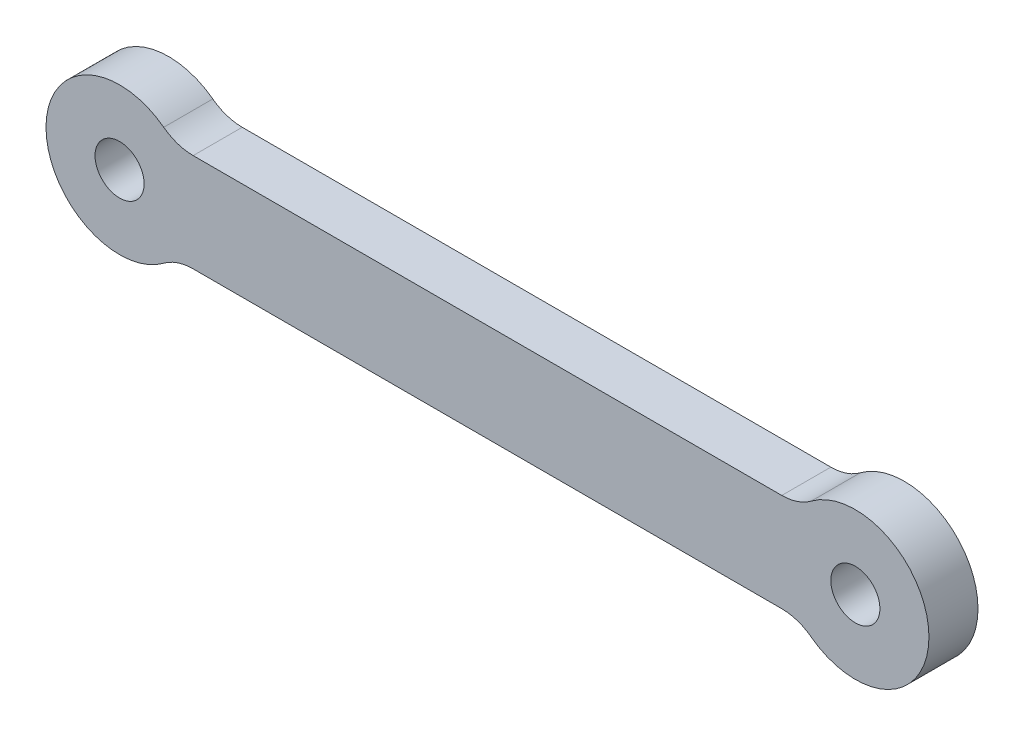
ISO-10303-21;
HEADER;
FILE_DESCRIPTION(('STEP AP214'),'2;1');
FILE_NAME('part.step','',(''),(''),'','','');
FILE_SCHEMA(('AUTOMOTIVE_DESIGN { 1 0 10303 214 1 1 1 1 }'));
ENDSEC;
DATA;
#1=APPLICATION_CONTEXT('core data for automotive mechanical design processes');
#2=APPLICATION_PROTOCOL_DEFINITION('international standard','automotive_design',2000,#1);
#3=PRODUCT_CONTEXT('',#1,'mechanical');
#4=PRODUCT('Part','Part','',(#3));
#5=PRODUCT_RELATED_PRODUCT_CATEGORY('part','',(#4));
#6=PRODUCT_DEFINITION_FORMATION('','',#4);
#7=PRODUCT_DEFINITION_CONTEXT('part definition',#1,'design');
#8=PRODUCT_DEFINITION('design','',#6,#7);
#9=PRODUCT_DEFINITION_SHAPE('','',#8);
#10=(LENGTH_UNIT() NAMED_UNIT(*) SI_UNIT(.MILLI.,.METRE.));
#11=(NAMED_UNIT(*) PLANE_ANGLE_UNIT() SI_UNIT($,.RADIAN.));
#12=(NAMED_UNIT(*) SI_UNIT($,.STERADIAN.) SOLID_ANGLE_UNIT());
#13=UNCERTAINTY_MEASURE_WITH_UNIT(LENGTH_MEASURE(1.E-05),#10,'distance_accuracy_value','');
#14=(GEOMETRIC_REPRESENTATION_CONTEXT(3) GLOBAL_UNCERTAINTY_ASSIGNED_CONTEXT((#13)) GLOBAL_UNIT_ASSIGNED_CONTEXT((#10,
#11,#12)) REPRESENTATION_CONTEXT('',''));
#15=CARTESIAN_POINT('',(0.,0.,0.));
#16=DIRECTION('',(0.,0.,1.));
#17=DIRECTION('',(1.,0.,0.));
#18=AXIS2_PLACEMENT_3D('',#15,#16,#17);
#19=CARTESIAN_POINT('',(12.,4.,2.));
#20=DIRECTION('',(0.,0.,1.));
#21=DIRECTION('',(1.,0.,0.));
#22=AXIS2_PLACEMENT_3D('',#19,#20,#21);
#23=PLANE('',#22);
#24=DIRECTION('',(1.,0.,0.));
#25=VECTOR('',#24,1.);
#26=CARTESIAN_POINT('',(0.,2.,2.));
#27=LINE('',#26,#25);
#28=CARTESIAN_POINT('',(-12.,2.,2.));
#29=VERTEX_POINT('',#28);
#30=CARTESIAN_POINT('',(12.,2.,2.));
#31=VERTEX_POINT('',#30);
#32=EDGE_CURVE('E198',#29,#31,#27,.T.);
#33=ORIENTED_EDGE('',*,*,#32,.F.);
#34=CARTESIAN_POINT('',(-12.,4.,2.));
#35=DIRECTION('',(0.,0.,-1.));
#36=DIRECTION('',(-1.,0.,0.));
#37=AXIS2_PLACEMENT_3D('',#34,#35,#36);
#38=CIRCLE('',#37,2.);
#39=CARTESIAN_POINT('',(-13.2,2.4,2.));
#40=VERTEX_POINT('',#39);
#41=EDGE_CURVE('E179',#29,#40,#38,.T.);
#42=ORIENTED_EDGE('',*,*,#41,.T.);
#43=CARTESIAN_POINT('',(-15.,0.,2.));
#44=DIRECTION('',(0.,0.,1.));
#45=DIRECTION('',(1.,0.,0.));
#46=AXIS2_PLACEMENT_3D('',#43,#44,#45);
#47=CIRCLE('',#46,3.);
#48=CARTESIAN_POINT('',(-13.2,-2.4,2.));
#49=VERTEX_POINT('',#48);
#50=EDGE_CURVE('E166',#40,#49,#47,.T.);
#51=ORIENTED_EDGE('',*,*,#50,.T.);
#52=CARTESIAN_POINT('',(-12.,-4.,2.));
#53=DIRECTION('',(0.,0.,-1.));
#54=DIRECTION('',(-1.,0.,0.));
#55=AXIS2_PLACEMENT_3D('',#52,#53,#54);
#56=CIRCLE('',#55,2.);
#57=CARTESIAN_POINT('',(-12.,-2.,2.));
#58=VERTEX_POINT('',#57);
#59=EDGE_CURVE('E163',#49,#58,#56,.T.);
#60=ORIENTED_EDGE('',*,*,#59,.T.);
#61=DIRECTION('',(-1.,0.,0.));
#62=VECTOR('',#61,1.);
#63=CARTESIAN_POINT('',(12.,-2.,2.));
#64=LINE('',#63,#62);
#65=CARTESIAN_POINT('',(12.,-2.,2.));
#66=VERTEX_POINT('',#65);
#67=EDGE_CURVE('E152',#66,#58,#64,.T.);
#68=ORIENTED_EDGE('',*,*,#67,.F.);
#69=CARTESIAN_POINT('',(12.,-4.,2.));
#70=DIRECTION('',(0.,0.,1.));
#71=DIRECTION('',(1.,0.,0.));
#72=AXIS2_PLACEMENT_3D('',#69,#70,#71);
#73=CIRCLE('',#72,2.);
#74=CARTESIAN_POINT('',(13.2,-2.4,2.));
#75=VERTEX_POINT('',#74);
#76=EDGE_CURVE('E160',#75,#66,#73,.T.);
#77=ORIENTED_EDGE('',*,*,#76,.F.);
#78=CARTESIAN_POINT('',(15.,0.,2.));
#79=DIRECTION('',(0.,0.,-1.));
#80=DIRECTION('',(-1.,0.,0.));
#81=AXIS2_PLACEMENT_3D('',#78,#79,#80);
#82=CIRCLE('',#81,3.);
#83=CARTESIAN_POINT('',(13.2,2.4,2.));
#84=VERTEX_POINT('',#83);
#85=EDGE_CURVE('E206',#84,#75,#82,.T.);
#86=ORIENTED_EDGE('',*,*,#85,.F.);
#87=CARTESIAN_POINT('',(12.,4.,2.));
#88=DIRECTION('',(0.,0.,1.));
#89=DIRECTION('',(1.,0.,0.));
#90=AXIS2_PLACEMENT_3D('',#87,#88,#89);
#91=CIRCLE('',#90,2.);
#92=EDGE_CURVE('E202',#31,#84,#91,.T.);
#93=ORIENTED_EDGE('',*,*,#92,.F.);
#94=EDGE_LOOP('',(#33,#42,#51,#60,#68,#77,#86,#93));
#95=FACE_BOUND('',#94,.T.);
#96=CARTESIAN_POINT('',(15.,0.,2.));
#97=DIRECTION('',(0.,0.,1.));
#98=DIRECTION('',(1.,0.,0.));
#99=AXIS2_PLACEMENT_3D('',#96,#97,#98);
#100=CIRCLE('',#99,1.);
#101=CARTESIAN_POINT('',(16.,0.,2.));
#102=VERTEX_POINT('',#101);
#103=EDGE_CURVE('E188',#102,#102,#100,.T.);
#104=ORIENTED_EDGE('',*,*,#103,.F.);
#105=EDGE_LOOP('',(#104));
#106=FACE_BOUND('',#105,.T.);
#107=CARTESIAN_POINT('',(-15.,0.,2.));
#108=DIRECTION('',(0.,0.,-1.));
#109=DIRECTION('',(-1.,0.,0.));
#110=AXIS2_PLACEMENT_3D('',#107,#108,#109);
#111=CIRCLE('',#110,1.);
#112=CARTESIAN_POINT('',(-16.,0.,2.));
#113=VERTEX_POINT('',#112);
#114=EDGE_CURVE('E292',#113,#113,#111,.T.);
#115=ORIENTED_EDGE('',*,*,#114,.T.);
#116=EDGE_LOOP('',(#115));
#117=FACE_BOUND('',#116,.T.);
#118=ADVANCED_FACE('F81',(#95,#106,#117),#23,.T.);
#119=CARTESIAN_POINT('',(12.,4.,0.));
#120=DIRECTION('',(0.,0.,1.));
#121=DIRECTION('',(1.,0.,0.));
#122=AXIS2_PLACEMENT_3D('',#119,#120,#121);
#123=PLANE('',#122);
#124=DIRECTION('',(-1.,0.,0.));
#125=VECTOR('',#124,1.);
#126=CARTESIAN_POINT('',(12.,-2.,0.));
#127=LINE('',#126,#125);
#128=CARTESIAN_POINT('',(12.,-2.,0.));
#129=VERTEX_POINT('',#128);
#130=CARTESIAN_POINT('',(-12.,-2.,0.));
#131=VERTEX_POINT('',#130);
#132=EDGE_CURVE('E203',#129,#131,#127,.T.);
#133=ORIENTED_EDGE('',*,*,#132,.T.);
#134=CARTESIAN_POINT('',(-12.,-4.,0.));
#135=DIRECTION('',(0.,0.,-1.));
#136=DIRECTION('',(-1.,0.,0.));
#137=AXIS2_PLACEMENT_3D('',#134,#135,#136);
#138=CIRCLE('',#137,2.);
#139=CARTESIAN_POINT('',(-13.2,-2.4,0.));
#140=VERTEX_POINT('',#139);
#141=EDGE_CURVE('E176',#140,#131,#138,.T.);
#142=ORIENTED_EDGE('',*,*,#141,.F.);
#143=CARTESIAN_POINT('',(-15.,0.,0.));
#144=DIRECTION('',(0.,0.,1.));
#145=DIRECTION('',(1.,0.,0.));
#146=AXIS2_PLACEMENT_3D('',#143,#144,#145);
#147=CIRCLE('',#146,3.);
#148=CARTESIAN_POINT('',(-13.2,2.4,0.));
#149=VERTEX_POINT('',#148);
#150=EDGE_CURVE('E240',#149,#140,#147,.T.);
#151=ORIENTED_EDGE('',*,*,#150,.F.);
#152=CARTESIAN_POINT('',(-12.,4.,0.));
#153=DIRECTION('',(0.,0.,-1.));
#154=DIRECTION('',(-1.,0.,0.));
#155=AXIS2_PLACEMENT_3D('',#152,#153,#154);
#156=CIRCLE('',#155,2.);
#157=CARTESIAN_POINT('',(-12.,2.,0.));
#158=VERTEX_POINT('',#157);
#159=EDGE_CURVE('E171',#158,#149,#156,.T.);
#160=ORIENTED_EDGE('',*,*,#159,.F.);
#161=DIRECTION('',(1.,0.,0.));
#162=VECTOR('',#161,1.);
#163=CARTESIAN_POINT('',(0.,2.,0.));
#164=LINE('',#163,#162);
#165=CARTESIAN_POINT('',(12.,2.,0.));
#166=VERTEX_POINT('',#165);
#167=EDGE_CURVE('E192',#158,#166,#164,.T.);
#168=ORIENTED_EDGE('',*,*,#167,.T.);
#169=CARTESIAN_POINT('',(12.,4.,0.));
#170=DIRECTION('',(0.,0.,1.));
#171=DIRECTION('',(1.,0.,0.));
#172=AXIS2_PLACEMENT_3D('',#169,#170,#171);
#173=CIRCLE('',#172,2.);
#174=CARTESIAN_POINT('',(13.2,2.4,0.));
#175=VERTEX_POINT('',#174);
#176=EDGE_CURVE('E214',#166,#175,#173,.T.);
#177=ORIENTED_EDGE('',*,*,#176,.T.);
#178=CARTESIAN_POINT('',(15.,0.,0.));
#179=DIRECTION('',(0.,0.,-1.));
#180=DIRECTION('',(-1.,0.,0.));
#181=AXIS2_PLACEMENT_3D('',#178,#179,#180);
#182=CIRCLE('',#181,3.);
#183=CARTESIAN_POINT('',(13.2,-2.4,0.));
#184=VERTEX_POINT('',#183);
#185=EDGE_CURVE('E218',#175,#184,#182,.T.);
#186=ORIENTED_EDGE('',*,*,#185,.T.);
#187=CARTESIAN_POINT('',(12.,-4.,0.));
#188=DIRECTION('',(0.,0.,1.));
#189=DIRECTION('',(1.,0.,0.));
#190=AXIS2_PLACEMENT_3D('',#187,#188,#189);
#191=CIRCLE('',#190,2.);
#192=EDGE_CURVE('E222',#184,#129,#191,.T.);
#193=ORIENTED_EDGE('',*,*,#192,.T.);
#194=EDGE_LOOP('',(#133,#142,#151,#160,#168,#177,#186,#193));
#195=FACE_BOUND('',#194,.T.);
#196=CARTESIAN_POINT('',(15.,0.,0.));
#197=DIRECTION('',(0.,0.,1.));
#198=DIRECTION('',(1.,0.,0.));
#199=AXIS2_PLACEMENT_3D('',#196,#197,#198);
#200=CIRCLE('',#199,1.);
#201=CARTESIAN_POINT('',(16.,0.,0.));
#202=VERTEX_POINT('',#201);
#203=EDGE_CURVE('E193',#202,#202,#200,.T.);
#204=ORIENTED_EDGE('',*,*,#203,.T.);
#205=EDGE_LOOP('',(#204));
#206=FACE_BOUND('',#205,.T.);
#207=CARTESIAN_POINT('',(-15.,0.,0.));
#208=DIRECTION('',(0.,0.,-1.));
#209=DIRECTION('',(-1.,0.,0.));
#210=AXIS2_PLACEMENT_3D('',#207,#208,#209);
#211=CIRCLE('',#210,1.);
#212=CARTESIAN_POINT('',(-16.,0.,0.));
#213=VERTEX_POINT('',#212);
#214=EDGE_CURVE('E295',#213,#213,#211,.T.);
#215=ORIENTED_EDGE('',*,*,#214,.F.);
#216=EDGE_LOOP('',(#215));
#217=FACE_BOUND('',#216,.T.);
#218=ADVANCED_FACE('F237',(#195,#206,#217),#123,.F.);
#219=CARTESIAN_POINT('',(12.,-2.,2.));
#220=DIRECTION('',(0.,-1.,0.));
#221=DIRECTION('',(0.,0.,-1.));
#222=AXIS2_PLACEMENT_3D('',#219,#220,#221);
#223=PLANE('',#222);
#224=ORIENTED_EDGE('',*,*,#132,.F.);
#225=DIRECTION('',(0.,0.,-1.));
#226=VECTOR('',#225,1.);
#227=CARTESIAN_POINT('',(12.,-2.,2.));
#228=LINE('',#227,#226);
#229=EDGE_CURVE('E12',#66,#129,#228,.T.);
#230=ORIENTED_EDGE('',*,*,#229,.F.);
#231=ORIENTED_EDGE('',*,*,#67,.T.);
#232=DIRECTION('',(0.,0.,-1.));
#233=VECTOR('',#232,1.);
#234=CARTESIAN_POINT('',(-12.,-2.,2.));
#235=LINE('',#234,#233);
#236=EDGE_CURVE('E156',#58,#131,#235,.T.);
#237=ORIENTED_EDGE('',*,*,#236,.T.);
#238=EDGE_LOOP('',(#224,#230,#231,#237));
#239=FACE_BOUND('',#238,.T.);
#240=ADVANCED_FACE('F154',(#239),#223,.T.);
#241=CARTESIAN_POINT('',(12.,-4.,2.));
#242=DIRECTION('',(0.,0.,-1.));
#243=DIRECTION('',(-1.,0.,0.));
#244=AXIS2_PLACEMENT_3D('',#241,#242,#243);
#245=CYLINDRICAL_SURFACE('',#244,2.);
#246=ORIENTED_EDGE('',*,*,#192,.F.);
#247=DIRECTION('',(0.,0.,-1.));
#248=VECTOR('',#247,1.);
#249=CARTESIAN_POINT('',(13.2,-2.4,2.));
#250=LINE('',#249,#248);
#251=EDGE_CURVE('E92',#75,#184,#250,.T.);
#252=ORIENTED_EDGE('',*,*,#251,.F.);
#253=ORIENTED_EDGE('',*,*,#76,.T.);
#254=ORIENTED_EDGE('',*,*,#229,.T.);
#255=EDGE_LOOP('',(#246,#252,#253,#254));
#256=FACE_BOUND('',#255,.T.);
#257=ADVANCED_FACE('F258',(#256),#245,.F.);
#258=CARTESIAN_POINT('',(15.,0.,2.));
#259=DIRECTION('',(0.,0.,-1.));
#260=DIRECTION('',(-1.,0.,0.));
#261=AXIS2_PLACEMENT_3D('',#258,#259,#260);
#262=CYLINDRICAL_SURFACE('',#261,3.);
#263=ORIENTED_EDGE('',*,*,#185,.F.);
#264=DIRECTION('',(0.,0.,-1.));
#265=VECTOR('',#264,1.);
#266=CARTESIAN_POINT('',(13.2,2.4,2.));
#267=LINE('',#266,#265);
#268=EDGE_CURVE('E228',#84,#175,#267,.T.);
#269=ORIENTED_EDGE('',*,*,#268,.F.);
#270=ORIENTED_EDGE('',*,*,#85,.T.);
#271=ORIENTED_EDGE('',*,*,#251,.T.);
#272=EDGE_LOOP('',(#263,#269,#270,#271));
#273=FACE_BOUND('',#272,.T.);
#274=ADVANCED_FACE('F257',(#273),#262,.T.);
#275=CARTESIAN_POINT('',(12.,4.,2.));
#276=DIRECTION('',(0.,0.,-1.));
#277=DIRECTION('',(-1.,0.,0.));
#278=AXIS2_PLACEMENT_3D('',#275,#276,#277);
#279=CYLINDRICAL_SURFACE('',#278,2.);
#280=ORIENTED_EDGE('',*,*,#176,.F.);
#281=DIRECTION('',(0.,0.,-1.));
#282=VECTOR('',#281,1.);
#283=CARTESIAN_POINT('',(12.,2.,2.));
#284=LINE('',#283,#282);
#285=EDGE_CURVE('E85',#31,#166,#284,.T.);
#286=ORIENTED_EDGE('',*,*,#285,.F.);
#287=ORIENTED_EDGE('',*,*,#92,.T.);
#288=ORIENTED_EDGE('',*,*,#268,.T.);
#289=EDGE_LOOP('',(#280,#286,#287,#288));
#290=FACE_BOUND('',#289,.T.);
#291=ADVANCED_FACE('F234',(#290),#279,.F.);
#292=CARTESIAN_POINT('',(0.,2.,2.));
#293=DIRECTION('',(0.,1.,0.));
#294=DIRECTION('',(0.,0.,1.));
#295=AXIS2_PLACEMENT_3D('',#292,#293,#294);
#296=PLANE('',#295);
#297=ORIENTED_EDGE('',*,*,#167,.F.);
#298=DIRECTION('',(0.,0.,-1.));
#299=VECTOR('',#298,1.);
#300=CARTESIAN_POINT('',(-12.,2.,2.));
#301=LINE('',#300,#299);
#302=EDGE_CURVE('E197',#29,#158,#301,.T.);
#303=ORIENTED_EDGE('',*,*,#302,.F.);
#304=ORIENTED_EDGE('',*,*,#32,.T.);
#305=ORIENTED_EDGE('',*,*,#285,.T.);
#306=EDGE_LOOP('',(#297,#303,#304,#305));
#307=FACE_BOUND('',#306,.T.);
#308=ADVANCED_FACE('F83',(#307),#296,.T.);
#309=CARTESIAN_POINT('',(15.,0.,2.));
#310=DIRECTION('',(0.,0.,-1.));
#311=DIRECTION('',(-1.,0.,0.));
#312=AXIS2_PLACEMENT_3D('',#309,#310,#311);
#313=CYLINDRICAL_SURFACE('',#312,1.);
#314=ORIENTED_EDGE('',*,*,#103,.T.);
#315=EDGE_LOOP('',(#314));
#316=FACE_BOUND('',#315,.T.);
#317=ORIENTED_EDGE('',*,*,#203,.F.);
#318=EDGE_LOOP('',(#317));
#319=FACE_BOUND('',#318,.T.);
#320=ADVANCED_FACE('F274',(#316,#319),#313,.F.);
#321=CARTESIAN_POINT('',(-12.,4.,2.));
#322=DIRECTION('',(0.,0.,-1.));
#323=DIRECTION('',(-1.,0.,0.));
#324=AXIS2_PLACEMENT_3D('',#321,#322,#323);
#325=CYLINDRICAL_SURFACE('',#324,2.);
#326=ORIENTED_EDGE('',*,*,#159,.T.);
#327=DIRECTION('',(0.,0.,-1.));
#328=VECTOR('',#327,1.);
#329=CARTESIAN_POINT('',(-13.2,2.4,2.));
#330=LINE('',#329,#328);
#331=EDGE_CURVE('E183',#40,#149,#330,.T.);
#332=ORIENTED_EDGE('',*,*,#331,.F.);
#333=ORIENTED_EDGE('',*,*,#41,.F.);
#334=ORIENTED_EDGE('',*,*,#302,.T.);
#335=EDGE_LOOP('',(#326,#332,#333,#334));
#336=FACE_BOUND('',#335,.T.);
#337=ADVANCED_FACE('F255',(#336),#325,.F.);
#338=CARTESIAN_POINT('',(-15.,0.,2.));
#339=DIRECTION('',(0.,0.,-1.));
#340=DIRECTION('',(-1.,0.,0.));
#341=AXIS2_PLACEMENT_3D('',#338,#339,#340);
#342=CYLINDRICAL_SURFACE('',#341,3.);
#343=ORIENTED_EDGE('',*,*,#150,.T.);
#344=DIRECTION('',(0.,0.,-1.));
#345=VECTOR('',#344,1.);
#346=CARTESIAN_POINT('',(-13.2,-2.4,2.));
#347=LINE('',#346,#345);
#348=EDGE_CURVE('E178',#49,#140,#347,.T.);
#349=ORIENTED_EDGE('',*,*,#348,.F.);
#350=ORIENTED_EDGE('',*,*,#50,.F.);
#351=ORIENTED_EDGE('',*,*,#331,.T.);
#352=EDGE_LOOP('',(#343,#349,#350,#351));
#353=FACE_BOUND('',#352,.T.);
#354=ADVANCED_FACE('F253',(#353),#342,.T.);
#355=CARTESIAN_POINT('',(-12.,-4.,2.));
#356=DIRECTION('',(0.,0.,-1.));
#357=DIRECTION('',(-1.,0.,0.));
#358=AXIS2_PLACEMENT_3D('',#355,#356,#357);
#359=CYLINDRICAL_SURFACE('',#358,2.);
#360=ORIENTED_EDGE('',*,*,#141,.T.);
#361=ORIENTED_EDGE('',*,*,#236,.F.);
#362=ORIENTED_EDGE('',*,*,#59,.F.);
#363=ORIENTED_EDGE('',*,*,#348,.T.);
#364=EDGE_LOOP('',(#360,#361,#362,#363));
#365=FACE_BOUND('',#364,.T.);
#366=ADVANCED_FACE('F174',(#365),#359,.F.);
#367=CARTESIAN_POINT('',(-15.,0.,2.));
#368=DIRECTION('',(0.,0.,-1.));
#369=DIRECTION('',(-1.,0.,0.));
#370=AXIS2_PLACEMENT_3D('',#367,#368,#369);
#371=CYLINDRICAL_SURFACE('',#370,1.);
#372=ORIENTED_EDGE('',*,*,#114,.F.);
#373=EDGE_LOOP('',(#372));
#374=FACE_BOUND('',#373,.T.);
#375=ORIENTED_EDGE('',*,*,#214,.T.);
#376=EDGE_LOOP('',(#375));
#377=FACE_BOUND('',#376,.T.);
#378=ADVANCED_FACE('F280',(#374,#377),#371,.F.);
#379=CLOSED_SHELL('',(#118,#218,#240,#257,#274,#291,#308,#320,#337,#354,#366,#378));
#380=MANIFOLD_SOLID_BREP('B2',#379);
#381=ADVANCED_BREP_SHAPE_REPRESENTATION('',(#18,#380),#14);
#382=SHAPE_DEFINITION_REPRESENTATION(#9,#381);
ENDSEC;
END-ISO-10303-21;
